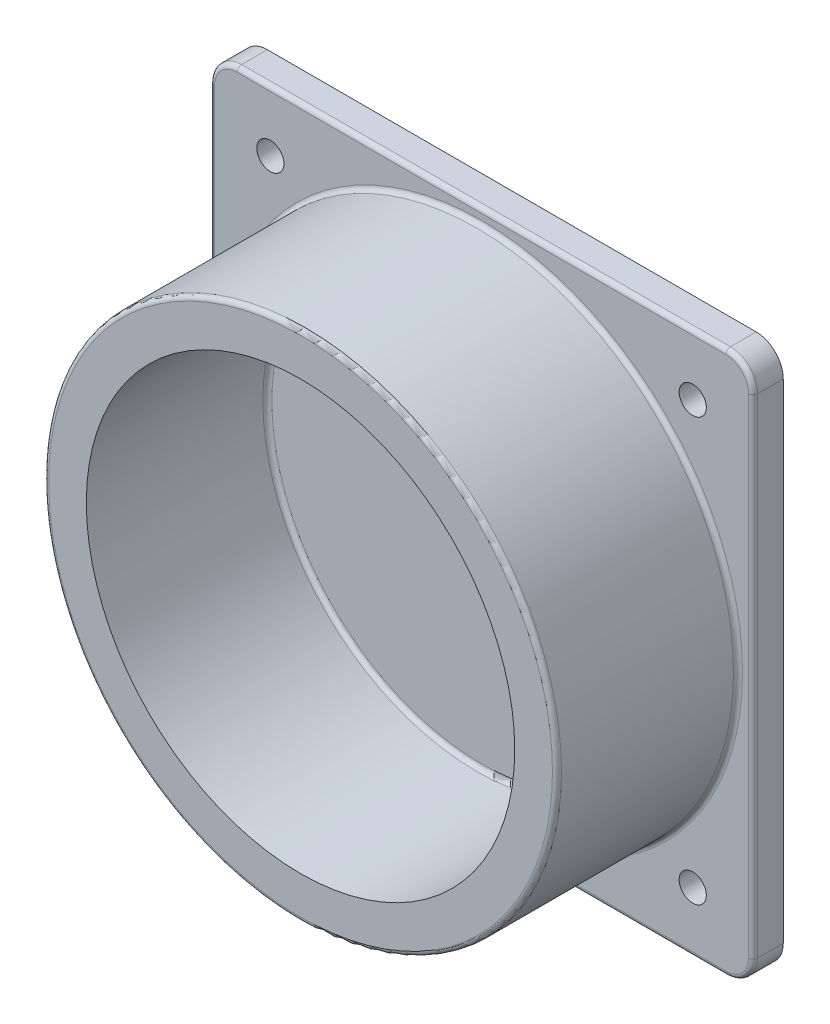
ISO-10303-21;
HEADER;
FILE_DESCRIPTION(('STEP AP214'),'2;1');
FILE_NAME('part.step','',(''),(''),'','','');
FILE_SCHEMA(('AUTOMOTIVE_DESIGN { 1 0 10303 214 1 1 1 1 }'));
ENDSEC;
DATA;
#1=APPLICATION_CONTEXT('core data for automotive mechanical design processes');
#2=APPLICATION_PROTOCOL_DEFINITION('international standard','automotive_design',2000,#1);
#3=PRODUCT_CONTEXT('',#1,'mechanical');
#4=PRODUCT('Part','Part','',(#3));
#5=PRODUCT_RELATED_PRODUCT_CATEGORY('part','',(#4));
#6=PRODUCT_DEFINITION_FORMATION('','',#4);
#7=PRODUCT_DEFINITION_CONTEXT('part definition',#1,'design');
#8=PRODUCT_DEFINITION('design','',#6,#7);
#9=PRODUCT_DEFINITION_SHAPE('','',#8);
#10=(LENGTH_UNIT() NAMED_UNIT(*) SI_UNIT(.MILLI.,.METRE.));
#11=(NAMED_UNIT(*) PLANE_ANGLE_UNIT() SI_UNIT($,.RADIAN.));
#12=(NAMED_UNIT(*) SI_UNIT($,.STERADIAN.) SOLID_ANGLE_UNIT());
#13=UNCERTAINTY_MEASURE_WITH_UNIT(LENGTH_MEASURE(1.E-05),#10,'distance_accuracy_value','');
#14=(GEOMETRIC_REPRESENTATION_CONTEXT(3) GLOBAL_UNCERTAINTY_ASSIGNED_CONTEXT((#13)) GLOBAL_UNIT_ASSIGNED_CONTEXT((#10,
#11,#12)) REPRESENTATION_CONTEXT('',''));
#15=CARTESIAN_POINT('',(0.,0.,0.));
#16=DIRECTION('',(0.,0.,1.));
#17=DIRECTION('',(1.,0.,0.));
#18=AXIS2_PLACEMENT_3D('',#15,#16,#17);
#19=CARTESIAN_POINT('',(81.,-81.,10.));
#20=DIRECTION('',(0.,0.,1.));
#21=DIRECTION('',(1.,0.,0.));
#22=AXIS2_PLACEMENT_3D('',#19,#20,#21);
#23=PLANE('',#22);
#24=DIRECTION('',(1.,0.,0.));
#25=VECTOR('',#24,1.);
#26=CARTESIAN_POINT('',(81.,-88.5,10.));
#27=LINE('',#26,#25);
#28=CARTESIAN_POINT('',(-81.,-88.5,10.));
#29=VERTEX_POINT('',#28);
#30=CARTESIAN_POINT('',(81.,-88.5,10.));
#31=VERTEX_POINT('',#30);
#32=EDGE_CURVE('E198',#29,#31,#27,.T.);
#33=ORIENTED_EDGE('',*,*,#32,.T.);
#34=CARTESIAN_POINT('',(81.,-81.,10.));
#35=DIRECTION('',(0.,0.,1.));
#36=DIRECTION('',(1.,0.,0.));
#37=AXIS2_PLACEMENT_3D('',#34,#35,#36);
#38=CIRCLE('',#37,7.49999999999999);
#39=CARTESIAN_POINT('',(88.5,-81.,10.));
#40=VERTEX_POINT('',#39);
#41=EDGE_CURVE('E200',#31,#40,#38,.T.);
#42=ORIENTED_EDGE('',*,*,#41,.T.);
#43=DIRECTION('',(0.,1.,0.));
#44=VECTOR('',#43,1.);
#45=CARTESIAN_POINT('',(88.5,81.,10.));
#46=LINE('',#45,#44);
#47=CARTESIAN_POINT('',(88.5,81.,10.));
#48=VERTEX_POINT('',#47);
#49=EDGE_CURVE('E186',#40,#48,#46,.T.);
#50=ORIENTED_EDGE('',*,*,#49,.T.);
#51=CARTESIAN_POINT('',(81.,81.,10.));
#52=DIRECTION('',(0.,0.,1.));
#53=DIRECTION('',(1.,0.,0.));
#54=AXIS2_PLACEMENT_3D('',#51,#52,#53);
#55=CIRCLE('',#54,7.49999999999999);
#56=CARTESIAN_POINT('',(81.,88.5,10.));
#57=VERTEX_POINT('',#56);
#58=EDGE_CURVE('E188',#48,#57,#55,.T.);
#59=ORIENTED_EDGE('',*,*,#58,.T.);
#60=DIRECTION('',(-1.,0.,0.));
#61=VECTOR('',#60,1.);
#62=CARTESIAN_POINT('',(-81.,88.5,10.));
#63=LINE('',#62,#61);
#64=CARTESIAN_POINT('',(-81.,88.5,10.));
#65=VERTEX_POINT('',#64);
#66=EDGE_CURVE('E190',#57,#65,#63,.T.);
#67=ORIENTED_EDGE('',*,*,#66,.T.);
#68=CARTESIAN_POINT('',(-81.,81.,10.));
#69=DIRECTION('',(0.,0.,1.));
#70=DIRECTION('',(1.,0.,0.));
#71=AXIS2_PLACEMENT_3D('',#68,#69,#70);
#72=CIRCLE('',#71,7.49999999999999);
#73=CARTESIAN_POINT('',(-88.5,81.,10.));
#74=VERTEX_POINT('',#73);
#75=EDGE_CURVE('E192',#65,#74,#72,.T.);
#76=ORIENTED_EDGE('',*,*,#75,.T.);
#77=DIRECTION('',(0.,-1.,0.));
#78=VECTOR('',#77,1.);
#79=CARTESIAN_POINT('',(-88.5,-81.,10.));
#80=LINE('',#79,#78);
#81=CARTESIAN_POINT('',(-88.5,-81.,10.));
#82=VERTEX_POINT('',#81);
#83=EDGE_CURVE('E194',#74,#82,#80,.T.);
#84=ORIENTED_EDGE('',*,*,#83,.T.);
#85=CARTESIAN_POINT('',(-81.,-81.,10.));
#86=DIRECTION('',(0.,0.,1.));
#87=DIRECTION('',(1.,0.,0.));
#88=AXIS2_PLACEMENT_3D('',#85,#86,#87);
#89=CIRCLE('',#88,7.49999999999999);
#90=EDGE_CURVE('E196',#82,#29,#89,.T.);
#91=ORIENTED_EDGE('',*,*,#90,.T.);
#92=EDGE_LOOP('',(#33,#42,#50,#59,#67,#76,#84,#91));
#93=FACE_BOUND('',#92,.T.);
#94=CARTESIAN_POINT('',(0.,0.,10.));
#95=DIRECTION('',(0.,0.,1.));
#96=DIRECTION('',(1.,0.,0.));
#97=AXIS2_PLACEMENT_3D('',#94,#95,#96);
#98=CIRCLE('',#97,86.5);
#99=CARTESIAN_POINT('',(86.5,0.,10.));
#100=VERTEX_POINT('',#99);
#101=EDGE_CURVE('E133',#100,#100,#98,.F.);
#102=ORIENTED_EDGE('',*,*,#101,.T.);
#103=EDGE_LOOP('',(#102));
#104=FACE_BOUND('',#103,.T.);
#105=CARTESIAN_POINT('',(-69.9999999999999,-70.,10.));
#106=DIRECTION('',(0.,0.,1.));
#107=DIRECTION('',(1.,0.,0.));
#108=AXIS2_PLACEMENT_3D('',#105,#106,#107);
#109=CIRCLE('',#108,4.50000000000001);
#110=CARTESIAN_POINT('',(-65.4999999999999,-70.,10.));
#111=VERTEX_POINT('',#110);
#112=EDGE_CURVE('E264',#111,#111,#109,.T.);
#113=ORIENTED_EDGE('',*,*,#112,.F.);
#114=EDGE_LOOP('',(#113));
#115=FACE_BOUND('',#114,.T.);
#116=CARTESIAN_POINT('',(-70.,70.,10.));
#117=DIRECTION('',(0.,0.,1.));
#118=DIRECTION('',(-1.,0.,0.));
#119=AXIS2_PLACEMENT_3D('',#116,#117,#118);
#120=CIRCLE('',#119,4.50000000000001);
#121=CARTESIAN_POINT('',(-74.5,70.,10.));
#122=VERTEX_POINT('',#121);
#123=EDGE_CURVE('E276',#122,#122,#120,.T.);
#124=ORIENTED_EDGE('',*,*,#123,.F.);
#125=EDGE_LOOP('',(#124));
#126=FACE_BOUND('',#125,.T.);
#127=CARTESIAN_POINT('',(70.,70.,10.));
#128=DIRECTION('',(0.,0.,1.));
#129=DIRECTION('',(1.,0.,0.));
#130=AXIS2_PLACEMENT_3D('',#127,#128,#129);
#131=CIRCLE('',#130,4.50000000000001);
#132=CARTESIAN_POINT('',(74.5,70.,10.));
#133=VERTEX_POINT('',#132);
#134=EDGE_CURVE('E153',#133,#133,#131,.T.);
#135=ORIENTED_EDGE('',*,*,#134,.F.);
#136=EDGE_LOOP('',(#135));
#137=FACE_BOUND('',#136,.T.);
#138=CARTESIAN_POINT('',(70.,-70.,10.));
#139=DIRECTION('',(0.,0.,1.));
#140=DIRECTION('',(-1.,0.,0.));
#141=AXIS2_PLACEMENT_3D('',#138,#139,#140);
#142=CIRCLE('',#141,4.50000000000001);
#143=CARTESIAN_POINT('',(65.4999999999999,-70.,10.));
#144=VERTEX_POINT('',#143);
#145=EDGE_CURVE('E270',#144,#144,#142,.T.);
#146=ORIENTED_EDGE('',*,*,#145,.F.);
#147=EDGE_LOOP('',(#146));
#148=FACE_BOUND('',#147,.T.);
#149=ADVANCED_FACE('F32',(#93,#104,#115,#126,#137,#148),#23,.T.);
#150=CARTESIAN_POINT('',(81.,-81.,0.));
#151=DIRECTION('',(0.,0.,1.));
#152=DIRECTION('',(1.,0.,0.));
#153=AXIS2_PLACEMENT_3D('',#150,#151,#152);
#154=PLANE('',#153);
#155=CARTESIAN_POINT('',(70.,-70.,0.));
#156=DIRECTION('',(0.,0.,1.));
#157=DIRECTION('',(-1.,0.,0.));
#158=AXIS2_PLACEMENT_3D('',#155,#156,#157);
#159=CIRCLE('',#158,4.50000000000001);
#160=CARTESIAN_POINT('',(65.4999999999999,-70.,0.));
#161=VERTEX_POINT('',#160);
#162=EDGE_CURVE('E267',#161,#161,#159,.T.);
#163=ORIENTED_EDGE('',*,*,#162,.T.);
#164=EDGE_LOOP('',(#163));
#165=FACE_BOUND('',#164,.T.);
#166=CARTESIAN_POINT('',(70.,70.,0.));
#167=DIRECTION('',(0.,0.,1.));
#168=DIRECTION('',(1.,0.,0.));
#169=AXIS2_PLACEMENT_3D('',#166,#167,#168);
#170=CIRCLE('',#169,4.50000000000001);
#171=CARTESIAN_POINT('',(74.5,70.,0.));
#172=VERTEX_POINT('',#171);
#173=EDGE_CURVE('E279',#172,#172,#170,.T.);
#174=ORIENTED_EDGE('',*,*,#173,.T.);
#175=EDGE_LOOP('',(#174));
#176=FACE_BOUND('',#175,.T.);
#177=CARTESIAN_POINT('',(81.,-81.,0.));
#178=DIRECTION('',(0.,0.,1.));
#179=DIRECTION('',(1.,0.,0.));
#180=AXIS2_PLACEMENT_3D('',#177,#178,#179);
#181=CIRCLE('',#180,8.99999999999999);
#182=CARTESIAN_POINT('',(81.,-90.,0.));
#183=VERTEX_POINT('',#182);
#184=CARTESIAN_POINT('',(90.,-81.,0.));
#185=VERTEX_POINT('',#184);
#186=EDGE_CURVE('E141',#183,#185,#181,.T.);
#187=ORIENTED_EDGE('',*,*,#186,.F.);
#188=DIRECTION('',(1.,0.,0.));
#189=VECTOR('',#188,1.);
#190=CARTESIAN_POINT('',(-81.,-90.,0.));
#191=LINE('',#190,#189);
#192=CARTESIAN_POINT('',(-81.,-90.,0.));
#193=VERTEX_POINT('',#192);
#194=EDGE_CURVE('E170',#193,#183,#191,.T.);
#195=ORIENTED_EDGE('',*,*,#194,.F.);
#196=CARTESIAN_POINT('',(-81.,-81.,0.));
#197=DIRECTION('',(0.,0.,1.));
#198=DIRECTION('',(-1.,0.,0.));
#199=AXIS2_PLACEMENT_3D('',#196,#197,#198);
#200=CIRCLE('',#199,8.99999999999999);
#201=CARTESIAN_POINT('',(-90.,-81.,0.));
#202=VERTEX_POINT('',#201);
#203=EDGE_CURVE('E167',#202,#193,#200,.T.);
#204=ORIENTED_EDGE('',*,*,#203,.F.);
#205=DIRECTION('',(0.,-1.,0.));
#206=VECTOR('',#205,1.);
#207=CARTESIAN_POINT('',(-90.,-81.,0.));
#208=LINE('',#207,#206);
#209=CARTESIAN_POINT('',(-90.,81.,0.));
#210=VERTEX_POINT('',#209);
#211=EDGE_CURVE('E164',#210,#202,#208,.T.);
#212=ORIENTED_EDGE('',*,*,#211,.F.);
#213=CARTESIAN_POINT('',(-81.,81.,0.));
#214=DIRECTION('',(0.,0.,1.));
#215=DIRECTION('',(-1.,0.,0.));
#216=AXIS2_PLACEMENT_3D('',#213,#214,#215);
#217=CIRCLE('',#216,8.99999999999999);
#218=CARTESIAN_POINT('',(-81.,90.,0.));
#219=VERTEX_POINT('',#218);
#220=EDGE_CURVE('E161',#219,#210,#217,.T.);
#221=ORIENTED_EDGE('',*,*,#220,.F.);
#222=DIRECTION('',(-1.,0.,0.));
#223=VECTOR('',#222,1.);
#224=CARTESIAN_POINT('',(-81.,90.,0.));
#225=LINE('',#224,#223);
#226=CARTESIAN_POINT('',(81.,90.,0.));
#227=VERTEX_POINT('',#226);
#228=EDGE_CURVE('E158',#227,#219,#225,.T.);
#229=ORIENTED_EDGE('',*,*,#228,.F.);
#230=CARTESIAN_POINT('',(81.,81.,0.));
#231=DIRECTION('',(0.,0.,1.));
#232=DIRECTION('',(-1.,0.,0.));
#233=AXIS2_PLACEMENT_3D('',#230,#231,#232);
#234=CIRCLE('',#233,8.99999999999999);
#235=CARTESIAN_POINT('',(90.,81.,0.));
#236=VERTEX_POINT('',#235);
#237=EDGE_CURVE('E144',#236,#227,#234,.T.);
#238=ORIENTED_EDGE('',*,*,#237,.F.);
#239=DIRECTION('',(0.,1.,0.));
#240=VECTOR('',#239,1.);
#241=CARTESIAN_POINT('',(90.,-81.,0.));
#242=LINE('',#241,#240);
#243=EDGE_CURVE('E126',#185,#236,#242,.T.);
#244=ORIENTED_EDGE('',*,*,#243,.F.);
#245=EDGE_LOOP('',(#187,#195,#204,#212,#221,#229,#238,#244));
#246=FACE_BOUND('',#245,.T.);
#247=CARTESIAN_POINT('',(0.,0.,0.));
#248=DIRECTION('',(0.,0.,1.));
#249=DIRECTION('',(1.,0.,0.));
#250=AXIS2_PLACEMENT_3D('',#247,#248,#249);
#251=CIRCLE('',#250,9.);
#252=CARTESIAN_POINT('',(9.00000000000001,0.,0.));
#253=VERTEX_POINT('',#252);
#254=EDGE_CURVE('E150',#253,#253,#251,.T.);
#255=ORIENTED_EDGE('',*,*,#254,.T.);
#256=EDGE_LOOP('',(#255));
#257=FACE_BOUND('',#256,.T.);
#258=CARTESIAN_POINT('',(-70.,70.,0.));
#259=DIRECTION('',(0.,0.,1.));
#260=DIRECTION('',(-1.,0.,0.));
#261=AXIS2_PLACEMENT_3D('',#258,#259,#260);
#262=CIRCLE('',#261,4.50000000000001);
#263=CARTESIAN_POINT('',(-74.5,70.,0.));
#264=VERTEX_POINT('',#263);
#265=EDGE_CURVE('E273',#264,#264,#262,.T.);
#266=ORIENTED_EDGE('',*,*,#265,.T.);
#267=EDGE_LOOP('',(#266));
#268=FACE_BOUND('',#267,.T.);
#269=CARTESIAN_POINT('',(-69.9999999999999,-70.,0.));
#270=DIRECTION('',(0.,0.,1.));
#271=DIRECTION('',(1.,0.,0.));
#272=AXIS2_PLACEMENT_3D('',#269,#270,#271);
#273=CIRCLE('',#272,4.50000000000001);
#274=CARTESIAN_POINT('',(-65.4999999999999,-70.,0.));
#275=VERTEX_POINT('',#274);
#276=EDGE_CURVE('E261',#275,#275,#273,.T.);
#277=ORIENTED_EDGE('',*,*,#276,.T.);
#278=EDGE_LOOP('',(#277));
#279=FACE_BOUND('',#278,.T.);
#280=ADVANCED_FACE('F138',(#165,#176,#246,#257,#268,#279),#154,.F.);
#281=CARTESIAN_POINT('',(81.,-81.,10.));
#282=DIRECTION('',(0.,0.,-1.));
#283=DIRECTION('',(-1.,0.,0.));
#284=AXIS2_PLACEMENT_3D('',#281,#282,#283);
#285=CYLINDRICAL_SURFACE('',#284,8.99999999999999);
#286=DIRECTION('',(0.,0.,-1.));
#287=VECTOR('',#286,1.);
#288=CARTESIAN_POINT('',(90.,-81.,10.));
#289=LINE('',#288,#287);
#290=CARTESIAN_POINT('',(90.,-81.,8.5));
#291=VERTEX_POINT('',#290);
#292=EDGE_CURVE('E123',#291,#185,#289,.T.);
#293=ORIENTED_EDGE('',*,*,#292,.F.);
#294=CARTESIAN_POINT('',(81.,-81.,8.5));
#295=DIRECTION('',(0.,0.,1.));
#296=DIRECTION('',(1.,0.,0.));
#297=AXIS2_PLACEMENT_3D('',#294,#295,#296);
#298=CIRCLE('',#297,8.99999999999999);
#299=CARTESIAN_POINT('',(81.,-90.,8.5));
#300=VERTEX_POINT('',#299);
#301=EDGE_CURVE('E203',#291,#300,#298,.F.);
#302=ORIENTED_EDGE('',*,*,#301,.T.);
#303=DIRECTION('',(0.,0.,-1.));
#304=VECTOR('',#303,1.);
#305=CARTESIAN_POINT('',(81.,-90.,10.));
#306=LINE('',#305,#304);
#307=EDGE_CURVE('E148',#300,#183,#306,.T.);
#308=ORIENTED_EDGE('',*,*,#307,.T.);
#309=ORIENTED_EDGE('',*,*,#186,.T.);
#310=EDGE_LOOP('',(#293,#302,#308,#309));
#311=FACE_BOUND('',#310,.T.);
#312=ADVANCED_FACE('F146',(#311),#285,.T.);
#313=CARTESIAN_POINT('',(90.,-81.,10.));
#314=DIRECTION('',(-1.,0.,0.));
#315=DIRECTION('',(0.,0.,1.));
#316=AXIS2_PLACEMENT_3D('',#313,#314,#315);
#317=PLANE('',#316);
#318=DIRECTION('',(0.,0.,-1.));
#319=VECTOR('',#318,1.);
#320=CARTESIAN_POINT('',(90.,81.,10.));
#321=LINE('',#320,#319);
#322=CARTESIAN_POINT('',(90.,81.,8.5));
#323=VERTEX_POINT('',#322);
#324=EDGE_CURVE('E134',#323,#236,#321,.T.);
#325=ORIENTED_EDGE('',*,*,#324,.F.);
#326=DIRECTION('',(0.,1.,0.));
#327=VECTOR('',#326,1.);
#328=CARTESIAN_POINT('',(90.,-81.,8.5));
#329=LINE('',#328,#327);
#330=EDGE_CURVE('E11',#323,#291,#329,.F.);
#331=ORIENTED_EDGE('',*,*,#330,.T.);
#332=ORIENTED_EDGE('',*,*,#292,.T.);
#333=ORIENTED_EDGE('',*,*,#243,.T.);
#334=EDGE_LOOP('',(#325,#331,#332,#333));
#335=FACE_BOUND('',#334,.T.);
#336=ADVANCED_FACE('F125',(#335),#317,.F.);
#337=CARTESIAN_POINT('',(81.,81.,10.));
#338=DIRECTION('',(0.,0.,-1.));
#339=DIRECTION('',(-1.,0.,0.));
#340=AXIS2_PLACEMENT_3D('',#337,#338,#339);
#341=CYLINDRICAL_SURFACE('',#340,8.99999999999999);
#342=DIRECTION('',(0.,0.,-1.));
#343=VECTOR('',#342,1.);
#344=CARTESIAN_POINT('',(81.,90.,10.));
#345=LINE('',#344,#343);
#346=CARTESIAN_POINT('',(81.,90.,8.5));
#347=VERTEX_POINT('',#346);
#348=EDGE_CURVE('E181',#347,#227,#345,.T.);
#349=ORIENTED_EDGE('',*,*,#348,.F.);
#350=CARTESIAN_POINT('',(81.,81.,8.5));
#351=DIRECTION('',(0.,0.,1.));
#352=DIRECTION('',(1.,0.,0.));
#353=AXIS2_PLACEMENT_3D('',#350,#351,#352);
#354=CIRCLE('',#353,8.99999999999999);
#355=EDGE_CURVE('E49',#347,#323,#354,.F.);
#356=ORIENTED_EDGE('',*,*,#355,.T.);
#357=ORIENTED_EDGE('',*,*,#324,.T.);
#358=ORIENTED_EDGE('',*,*,#237,.T.);
#359=EDGE_LOOP('',(#349,#356,#357,#358));
#360=FACE_BOUND('',#359,.T.);
#361=ADVANCED_FACE('F331',(#360),#341,.T.);
#362=CARTESIAN_POINT('',(-81.,90.,10.));
#363=DIRECTION('',(0.,-1.,0.));
#364=DIRECTION('',(0.,0.,-1.));
#365=AXIS2_PLACEMENT_3D('',#362,#363,#364);
#366=PLANE('',#365);
#367=DIRECTION('',(0.,0.,-1.));
#368=VECTOR('',#367,1.);
#369=CARTESIAN_POINT('',(-81.,90.,10.));
#370=LINE('',#369,#368);
#371=CARTESIAN_POINT('',(-81.,90.,8.5));
#372=VERTEX_POINT('',#371);
#373=EDGE_CURVE('E179',#372,#219,#370,.T.);
#374=ORIENTED_EDGE('',*,*,#373,.F.);
#375=DIRECTION('',(-1.,0.,0.));
#376=VECTOR('',#375,1.);
#377=CARTESIAN_POINT('',(81.,90.,8.5));
#378=LINE('',#377,#376);
#379=EDGE_CURVE('E57',#372,#347,#378,.F.);
#380=ORIENTED_EDGE('',*,*,#379,.T.);
#381=ORIENTED_EDGE('',*,*,#348,.T.);
#382=ORIENTED_EDGE('',*,*,#228,.T.);
#383=EDGE_LOOP('',(#374,#380,#381,#382));
#384=FACE_BOUND('',#383,.T.);
#385=ADVANCED_FACE('F327',(#384),#366,.F.);
#386=CARTESIAN_POINT('',(-81.,81.,10.));
#387=DIRECTION('',(0.,0.,-1.));
#388=DIRECTION('',(-1.,0.,0.));
#389=AXIS2_PLACEMENT_3D('',#386,#387,#388);
#390=CYLINDRICAL_SURFACE('',#389,8.99999999999999);
#391=DIRECTION('',(0.,0.,-1.));
#392=VECTOR('',#391,1.);
#393=CARTESIAN_POINT('',(-90.,81.,10.));
#394=LINE('',#393,#392);
#395=CARTESIAN_POINT('',(-90.,81.,8.5));
#396=VERTEX_POINT('',#395);
#397=EDGE_CURVE('E177',#396,#210,#394,.T.);
#398=ORIENTED_EDGE('',*,*,#397,.F.);
#399=CARTESIAN_POINT('',(-81.,81.,8.5));
#400=DIRECTION('',(0.,0.,1.));
#401=DIRECTION('',(1.,0.,0.));
#402=AXIS2_PLACEMENT_3D('',#399,#400,#401);
#403=CIRCLE('',#402,8.99999999999999);
#404=EDGE_CURVE('E211',#396,#372,#403,.F.);
#405=ORIENTED_EDGE('',*,*,#404,.T.);
#406=ORIENTED_EDGE('',*,*,#373,.T.);
#407=ORIENTED_EDGE('',*,*,#220,.T.);
#408=EDGE_LOOP('',(#398,#405,#406,#407));
#409=FACE_BOUND('',#408,.T.);
#410=ADVANCED_FACE('F323',(#409),#390,.T.);
#411=CARTESIAN_POINT('',(-90.,-81.,10.));
#412=DIRECTION('',(1.,0.,0.));
#413=DIRECTION('',(0.,0.,-1.));
#414=AXIS2_PLACEMENT_3D('',#411,#412,#413);
#415=PLANE('',#414);
#416=DIRECTION('',(0.,0.,-1.));
#417=VECTOR('',#416,1.);
#418=CARTESIAN_POINT('',(-90.,-81.,10.));
#419=LINE('',#418,#417);
#420=CARTESIAN_POINT('',(-90.,-81.,8.5));
#421=VERTEX_POINT('',#420);
#422=EDGE_CURVE('E175',#421,#202,#419,.T.);
#423=ORIENTED_EDGE('',*,*,#422,.F.);
#424=DIRECTION('',(0.,-1.,0.));
#425=VECTOR('',#424,1.);
#426=CARTESIAN_POINT('',(-90.,81.,8.5));
#427=LINE('',#426,#425);
#428=EDGE_CURVE('E209',#421,#396,#427,.F.);
#429=ORIENTED_EDGE('',*,*,#428,.T.);
#430=ORIENTED_EDGE('',*,*,#397,.T.);
#431=ORIENTED_EDGE('',*,*,#211,.T.);
#432=EDGE_LOOP('',(#423,#429,#430,#431));
#433=FACE_BOUND('',#432,.T.);
#434=ADVANCED_FACE('F319',(#433),#415,.F.);
#435=CARTESIAN_POINT('',(-81.,-81.,10.));
#436=DIRECTION('',(0.,0.,-1.));
#437=DIRECTION('',(-1.,0.,0.));
#438=AXIS2_PLACEMENT_3D('',#435,#436,#437);
#439=CYLINDRICAL_SURFACE('',#438,8.99999999999999);
#440=DIRECTION('',(0.,0.,-1.));
#441=VECTOR('',#440,1.);
#442=CARTESIAN_POINT('',(-81.,-90.,10.));
#443=LINE('',#442,#441);
#444=CARTESIAN_POINT('',(-81.,-90.,8.5));
#445=VERTEX_POINT('',#444);
#446=EDGE_CURVE('E173',#445,#193,#443,.T.);
#447=ORIENTED_EDGE('',*,*,#446,.F.);
#448=CARTESIAN_POINT('',(-81.,-81.,8.5));
#449=DIRECTION('',(0.,0.,1.));
#450=DIRECTION('',(1.,0.,0.));
#451=AXIS2_PLACEMENT_3D('',#448,#449,#450);
#452=CIRCLE('',#451,8.99999999999999);
#453=EDGE_CURVE('E207',#445,#421,#452,.F.);
#454=ORIENTED_EDGE('',*,*,#453,.T.);
#455=ORIENTED_EDGE('',*,*,#422,.T.);
#456=ORIENTED_EDGE('',*,*,#203,.T.);
#457=EDGE_LOOP('',(#447,#454,#455,#456));
#458=FACE_BOUND('',#457,.T.);
#459=ADVANCED_FACE('F315',(#458),#439,.T.);
#460=CARTESIAN_POINT('',(-81.,-90.,10.));
#461=DIRECTION('',(0.,1.,0.));
#462=DIRECTION('',(0.,0.,1.));
#463=AXIS2_PLACEMENT_3D('',#460,#461,#462);
#464=PLANE('',#463);
#465=ORIENTED_EDGE('',*,*,#307,.F.);
#466=DIRECTION('',(1.,0.,0.));
#467=VECTOR('',#466,1.);
#468=CARTESIAN_POINT('',(-81.,-90.,8.5));
#469=LINE('',#468,#467);
#470=EDGE_CURVE('E205',#300,#445,#469,.F.);
#471=ORIENTED_EDGE('',*,*,#470,.T.);
#472=ORIENTED_EDGE('',*,*,#446,.T.);
#473=ORIENTED_EDGE('',*,*,#194,.T.);
#474=EDGE_LOOP('',(#465,#471,#472,#473));
#475=FACE_BOUND('',#474,.T.);
#476=ADVANCED_FACE('F300',(#475),#464,.F.);
#477=CARTESIAN_POINT('',(0.,0.,10.));
#478=DIRECTION('',(0.,0.,-1.));
#479=DIRECTION('',(-1.,0.,0.));
#480=AXIS2_PLACEMENT_3D('',#477,#478,#479);
#481=CYLINDRICAL_SURFACE('',#480,9.);
#482=CARTESIAN_POINT('',(0.,0.,10.));
#483=DIRECTION('',(0.,0.,1.));
#484=DIRECTION('',(1.,0.,0.));
#485=AXIS2_PLACEMENT_3D('',#482,#483,#484);
#486=CIRCLE('',#485,9.);
#487=CARTESIAN_POINT('',(9.00000000000001,0.,10.));
#488=VERTEX_POINT('',#487);
#489=EDGE_CURVE('E256',#488,#488,#486,.T.);
#490=ORIENTED_EDGE('',*,*,#489,.T.);
#491=EDGE_LOOP('',(#490));
#492=FACE_BOUND('',#491,.T.);
#493=ORIENTED_EDGE('',*,*,#254,.F.);
#494=EDGE_LOOP('',(#493));
#495=FACE_BOUND('',#494,.T.);
#496=ADVANCED_FACE('F290',(#492,#495),#481,.F.);
#497=CARTESIAN_POINT('',(70.,70.,10.));
#498=DIRECTION('',(0.,0.,-1.));
#499=DIRECTION('',(-1.,0.,0.));
#500=AXIS2_PLACEMENT_3D('',#497,#498,#499);
#501=CYLINDRICAL_SURFACE('',#500,4.50000000000001);
#502=ORIENTED_EDGE('',*,*,#134,.T.);
#503=EDGE_LOOP('',(#502));
#504=FACE_BOUND('',#503,.T.);
#505=ORIENTED_EDGE('',*,*,#173,.F.);
#506=EDGE_LOOP('',(#505));
#507=FACE_BOUND('',#506,.T.);
#508=ADVANCED_FACE('F287',(#504,#507),#501,.F.);
#509=CARTESIAN_POINT('',(-70.,70.,10.));
#510=DIRECTION('',(0.,0.,-1.));
#511=DIRECTION('',(-1.,0.,0.));
#512=AXIS2_PLACEMENT_3D('',#509,#510,#511);
#513=CYLINDRICAL_SURFACE('',#512,4.50000000000001);
#514=ORIENTED_EDGE('',*,*,#123,.T.);
#515=EDGE_LOOP('',(#514));
#516=FACE_BOUND('',#515,.T.);
#517=ORIENTED_EDGE('',*,*,#265,.F.);
#518=EDGE_LOOP('',(#517));
#519=FACE_BOUND('',#518,.T.);
#520=ADVANCED_FACE('F289',(#516,#519),#513,.F.);
#521=CARTESIAN_POINT('',(70.,-70.,10.));
#522=DIRECTION('',(0.,0.,-1.));
#523=DIRECTION('',(-1.,0.,0.));
#524=AXIS2_PLACEMENT_3D('',#521,#522,#523);
#525=CYLINDRICAL_SURFACE('',#524,4.50000000000001);
#526=ORIENTED_EDGE('',*,*,#145,.T.);
#527=EDGE_LOOP('',(#526));
#528=FACE_BOUND('',#527,.T.);
#529=ORIENTED_EDGE('',*,*,#162,.F.);
#530=EDGE_LOOP('',(#529));
#531=FACE_BOUND('',#530,.T.);
#532=ADVANCED_FACE('F297',(#528,#531),#525,.F.);
#533=CARTESIAN_POINT('',(-69.9999999999999,-70.,10.));
#534=DIRECTION('',(0.,0.,-1.));
#535=DIRECTION('',(-1.,0.,0.));
#536=AXIS2_PLACEMENT_3D('',#533,#534,#535);
#537=CYLINDRICAL_SURFACE('',#536,4.50000000000001);
#538=ORIENTED_EDGE('',*,*,#112,.T.);
#539=EDGE_LOOP('',(#538));
#540=FACE_BOUND('',#539,.T.);
#541=ORIENTED_EDGE('',*,*,#276,.F.);
#542=EDGE_LOOP('',(#541));
#543=FACE_BOUND('',#542,.T.);
#544=ADVANCED_FACE('F395',(#540,#543),#537,.F.);
#545=CARTESIAN_POINT('',(0.,0.,70.));
#546=DIRECTION('',(0.,0.,-1.));
#547=DIRECTION('',(-1.,0.,0.));
#548=AXIS2_PLACEMENT_3D('',#545,#546,#547);
#549=CYLINDRICAL_SURFACE('',#548,85.);
#550=CARTESIAN_POINT('',(0.,0.,68.5));
#551=DIRECTION('',(0.,0.,1.));
#552=DIRECTION('',(1.,0.,0.));
#553=AXIS2_PLACEMENT_3D('',#550,#551,#552);
#554=CIRCLE('',#553,85.);
#555=CARTESIAN_POINT('',(-85.,0.,68.5));
#556=VERTEX_POINT('',#555);
#557=EDGE_CURVE('E221',#556,#556,#554,.F.);
#558=CARTESIAN_POINT('',(0.,0.,11.5));
#559=DIRECTION('',(0.,0.,1.));
#560=DIRECTION('',(1.,0.,0.));
#561=AXIS2_PLACEMENT_3D('',#558,#559,#560);
#562=CIRCLE('',#561,85.);
#563=CARTESIAN_POINT('',(-85.,0.,11.5));
#564=VERTEX_POINT('',#563);
#565=EDGE_CURVE('E218',#564,#564,#562,.T.);
#566=CARTESIAN_POINT('',(-85.,0.,68.5));
#567=CARTESIAN_POINT('',(-85.,0.,67.90625));
#568=CARTESIAN_POINT('',(-85.,0.,67.3125));
#569=CARTESIAN_POINT('',(-85.,0.,66.125));
#570=CARTESIAN_POINT('',(-85.,0.,65.53125));
#571=CARTESIAN_POINT('',(-85.,0.,64.34375));
#572=CARTESIAN_POINT('',(-85.,0.,63.75));
#573=CARTESIAN_POINT('',(-85.,0.,62.5625));
#574=CARTESIAN_POINT('',(-85.,0.,61.96875));
#575=CARTESIAN_POINT('',(-85.,0.,60.78125));
#576=CARTESIAN_POINT('',(-85.,0.,60.1875));
#577=CARTESIAN_POINT('',(-85.,0.,59.));
#578=CARTESIAN_POINT('',(-85.,0.,58.40625));
#579=CARTESIAN_POINT('',(-85.,0.,57.21875));
#580=CARTESIAN_POINT('',(-85.,0.,56.625));
#581=CARTESIAN_POINT('',(-85.,0.,55.4375));
#582=CARTESIAN_POINT('',(-85.,0.,54.84375));
#583=CARTESIAN_POINT('',(-85.,0.,53.65625));
#584=CARTESIAN_POINT('',(-85.,0.,53.0625));
#585=CARTESIAN_POINT('',(-85.,0.,51.875));
#586=CARTESIAN_POINT('',(-85.,0.,51.28125));
#587=CARTESIAN_POINT('',(-85.,0.,50.09375));
#588=CARTESIAN_POINT('',(-85.,0.,49.5));
#589=CARTESIAN_POINT('',(-85.,0.,48.3125));
#590=CARTESIAN_POINT('',(-85.,0.,47.71875));
#591=CARTESIAN_POINT('',(-85.,0.,46.53125));
#592=CARTESIAN_POINT('',(-85.,0.,45.9375));
#593=CARTESIAN_POINT('',(-85.,0.,44.75));
#594=CARTESIAN_POINT('',(-85.,0.,44.15625));
#595=CARTESIAN_POINT('',(-85.,0.,42.96875));
#596=CARTESIAN_POINT('',(-85.,0.,42.375));
#597=CARTESIAN_POINT('',(-85.,0.,41.1875));
#598=CARTESIAN_POINT('',(-85.,0.,40.59375));
#599=CARTESIAN_POINT('',(-85.,0.,39.40625));
#600=CARTESIAN_POINT('',(-85.,0.,38.8125));
#601=CARTESIAN_POINT('',(-85.,0.,37.625));
#602=CARTESIAN_POINT('',(-85.,0.,37.03125));
#603=CARTESIAN_POINT('',(-85.,0.,35.84375));
#604=CARTESIAN_POINT('',(-85.,0.,35.25));
#605=CARTESIAN_POINT('',(-85.,0.,34.0625));
#606=CARTESIAN_POINT('',(-85.,0.,33.46875));
#607=CARTESIAN_POINT('',(-85.,0.,32.28125));
#608=CARTESIAN_POINT('',(-85.,0.,31.6875));
#609=CARTESIAN_POINT('',(-85.,0.,30.5));
#610=CARTESIAN_POINT('',(-85.,0.,29.90625));
#611=CARTESIAN_POINT('',(-85.,0.,28.71875));
#612=CARTESIAN_POINT('',(-85.,0.,28.125));
#613=CARTESIAN_POINT('',(-85.,0.,26.9375));
#614=CARTESIAN_POINT('',(-85.,0.,26.34375));
#615=CARTESIAN_POINT('',(-85.,0.,25.15625));
#616=CARTESIAN_POINT('',(-85.,0.,24.5625));
#617=CARTESIAN_POINT('',(-85.,0.,23.375));
#618=CARTESIAN_POINT('',(-85.,0.,22.78125));
#619=CARTESIAN_POINT('',(-85.,0.,21.59375));
#620=CARTESIAN_POINT('',(-85.,0.,21.));
#621=CARTESIAN_POINT('',(-85.,0.,19.8125));
#622=CARTESIAN_POINT('',(-85.,0.,19.21875));
#623=CARTESIAN_POINT('',(-85.,0.,18.03125));
#624=CARTESIAN_POINT('',(-85.,0.,17.4375));
#625=CARTESIAN_POINT('',(-85.,0.,16.25));
#626=CARTESIAN_POINT('',(-85.,0.,15.65625));
#627=CARTESIAN_POINT('',(-85.,0.,14.46875));
#628=CARTESIAN_POINT('',(-85.,0.,13.875));
#629=CARTESIAN_POINT('',(-85.,0.,12.6875));
#630=CARTESIAN_POINT('',(-85.,0.,12.09375));
#631=CARTESIAN_POINT('',(-85.,0.,11.5));
#632=B_SPLINE_CURVE_WITH_KNOTS('',3,(#566,#567,#568,#569,#570,#571,#572,#573,#574,#575,#576,
#577,#578,#579,#580,#581,#582,#583,#584,#585,#586,#587,#588,#589,#590,#591,#592,#593,#594,#595,
#596,#597,#598,#599,#600,#601,#602,#603,#604,#605,#606,#607,#608,#609,#610,#611,#612,#613,#614,
#615,#616,#617,#618,#619,#620,#621,#622,#623,#624,#625,#626,#627,#628,#629,#630,#631),
.UNSPECIFIED.,.F.,.F.,(4,2,2,2,2,2,2,2,2,2,2,2,2,2,2,2,2,2,2,2,2,2,2,2,2,2,2,2,2,2,2,2,4),(0.,
1.78125,3.5625,5.34374999999999,7.12499999999999,8.90624999999999,10.6875,12.46875,14.25,
16.03125,17.8125,19.59375,21.375,23.15625,24.9375,26.71875,28.5,30.28125,32.0625,33.84375,
35.625,37.40625,39.1875,40.96875,42.75,44.53125,46.3125,48.09375,49.875,51.65625,53.4375,
55.21875,57.),.UNSPECIFIED.);
#633=EDGE_CURVE('BSEAM397',#556,#564,#632,.T.);
#634=ORIENTED_EDGE('',*,*,#557,.T.);
#635=ORIENTED_EDGE('',*,*,#565,.T.);
#636=ORIENTED_EDGE('',*,*,#633,.T.);
#637=ORIENTED_EDGE('',*,*,#633,.F.);
#638=EDGE_LOOP('',(#634,#636,#635,#637));
#639=FACE_BOUND('',#638,.T.);
#640=ADVANCED_FACE('F397',(#639),#549,.T.);
#641=CARTESIAN_POINT('',(0.,0.,70.));
#642=DIRECTION('',(0.,0.,1.));
#643=DIRECTION('',(1.,0.,0.));
#644=AXIS2_PLACEMENT_3D('',#641,#642,#643);
#645=PLANE('',#644);
#646=CARTESIAN_POINT('',(0.,0.,70.));
#647=DIRECTION('',(0.,0.,1.));
#648=DIRECTION('',(1.,0.,0.));
#649=AXIS2_PLACEMENT_3D('',#646,#647,#648);
#650=CIRCLE('',#649,83.5);
#651=CARTESIAN_POINT('',(83.5,0.,70.));
#652=VERTEX_POINT('',#651);
#653=EDGE_CURVE('E215',#652,#652,#650,.T.);
#654=ORIENTED_EDGE('',*,*,#653,.T.);
#655=EDGE_LOOP('',(#654));
#656=FACE_BOUND('',#655,.T.);
#657=CARTESIAN_POINT('',(0.,0.,70.));
#658=DIRECTION('',(0.,0.,1.));
#659=DIRECTION('',(1.,0.,0.));
#660=AXIS2_PLACEMENT_3D('',#657,#658,#659);
#661=CIRCLE('',#660,71.);
#662=CARTESIAN_POINT('',(71.,0.,70.));
#663=VERTEX_POINT('',#662);
#664=EDGE_CURVE('E250',#663,#663,#661,.T.);
#665=ORIENTED_EDGE('',*,*,#664,.F.);
#666=EDGE_LOOP('',(#665));
#667=FACE_BOUND('',#666,.T.);
#668=ADVANCED_FACE('F404',(#656,#667),#645,.T.);
#669=CARTESIAN_POINT('',(0.,0.,10.));
#670=DIRECTION('',(0.,0.,1.));
#671=DIRECTION('',(1.,0.,0.));
#672=AXIS2_PLACEMENT_3D('',#669,#670,#671);
#673=CYLINDRICAL_SURFACE('',#672,71.);
#674=CARTESIAN_POINT('',(0.,0.,11.5));
#675=DIRECTION('',(0.,0.,1.));
#676=DIRECTION('',(1.,0.,0.));
#677=AXIS2_PLACEMENT_3D('',#674,#675,#676);
#678=CIRCLE('',#677,71.);
#679=CARTESIAN_POINT('',(71.,0.,11.5));
#680=VERTEX_POINT('',#679);
#681=EDGE_CURVE('E41',#680,#680,#678,.F.);
#682=CARTESIAN_POINT('',(71.,0.,11.5));
#683=CARTESIAN_POINT('',(71.,0.,12.109375));
#684=CARTESIAN_POINT('',(71.,0.,12.71875));
#685=CARTESIAN_POINT('',(71.,0.,13.9375));
#686=CARTESIAN_POINT('',(71.,0.,14.546875));
#687=CARTESIAN_POINT('',(71.,0.,15.765625));
#688=CARTESIAN_POINT('',(71.,0.,16.375));
#689=CARTESIAN_POINT('',(71.,0.,17.59375));
#690=CARTESIAN_POINT('',(71.,0.,18.203125));
#691=CARTESIAN_POINT('',(71.,0.,19.421875));
#692=CARTESIAN_POINT('',(71.,0.,20.03125));
#693=CARTESIAN_POINT('',(71.,0.,21.25));
#694=CARTESIAN_POINT('',(71.,0.,21.859375));
#695=CARTESIAN_POINT('',(71.,0.,23.078125));
#696=CARTESIAN_POINT('',(71.,0.,23.6875));
#697=CARTESIAN_POINT('',(71.,0.,24.90625));
#698=CARTESIAN_POINT('',(71.,0.,25.515625));
#699=CARTESIAN_POINT('',(71.,0.,26.734375));
#700=CARTESIAN_POINT('',(71.,0.,27.34375));
#701=CARTESIAN_POINT('',(71.,0.,28.5625));
#702=CARTESIAN_POINT('',(71.,0.,29.171875));
#703=CARTESIAN_POINT('',(71.,0.,30.390625));
#704=CARTESIAN_POINT('',(71.,0.,31.));
#705=CARTESIAN_POINT('',(71.,0.,32.21875));
#706=CARTESIAN_POINT('',(71.,0.,32.828125));
#707=CARTESIAN_POINT('',(71.,0.,34.046875));
#708=CARTESIAN_POINT('',(71.,0.,34.65625));
#709=CARTESIAN_POINT('',(71.,0.,35.875));
#710=CARTESIAN_POINT('',(71.,0.,36.484375));
#711=CARTESIAN_POINT('',(71.,0.,37.703125));
#712=CARTESIAN_POINT('',(71.,0.,38.3125));
#713=CARTESIAN_POINT('',(71.,0.,39.53125));
#714=CARTESIAN_POINT('',(71.,0.,40.140625));
#715=CARTESIAN_POINT('',(71.,0.,41.359375));
#716=CARTESIAN_POINT('',(71.,0.,41.96875));
#717=CARTESIAN_POINT('',(71.,0.,43.1875));
#718=CARTESIAN_POINT('',(71.,0.,43.796875));
#719=CARTESIAN_POINT('',(71.,0.,45.015625));
#720=CARTESIAN_POINT('',(71.,0.,45.625));
#721=CARTESIAN_POINT('',(71.,0.,46.84375));
#722=CARTESIAN_POINT('',(71.,0.,47.453125));
#723=CARTESIAN_POINT('',(71.,0.,48.671875));
#724=CARTESIAN_POINT('',(71.,0.,49.28125));
#725=CARTESIAN_POINT('',(71.,0.,50.5));
#726=CARTESIAN_POINT('',(71.,0.,51.109375));
#727=CARTESIAN_POINT('',(71.,0.,52.328125));
#728=CARTESIAN_POINT('',(71.,0.,52.9375));
#729=CARTESIAN_POINT('',(71.,0.,54.15625));
#730=CARTESIAN_POINT('',(71.,0.,54.765625));
#731=CARTESIAN_POINT('',(71.,0.,55.984375));
#732=CARTESIAN_POINT('',(71.,0.,56.59375));
#733=CARTESIAN_POINT('',(71.,0.,57.8125));
#734=CARTESIAN_POINT('',(71.,0.,58.421875));
#735=CARTESIAN_POINT('',(71.,0.,59.640625));
#736=CARTESIAN_POINT('',(71.,0.,60.25));
#737=CARTESIAN_POINT('',(71.,0.,61.46875));
#738=CARTESIAN_POINT('',(71.,0.,62.078125));
#739=CARTESIAN_POINT('',(71.,0.,63.296875));
#740=CARTESIAN_POINT('',(71.,0.,63.90625));
#741=CARTESIAN_POINT('',(71.,0.,65.125));
#742=CARTESIAN_POINT('',(71.,0.,65.734375));
#743=CARTESIAN_POINT('',(71.,0.,66.953125));
#744=CARTESIAN_POINT('',(71.,0.,67.5625));
#745=CARTESIAN_POINT('',(71.,0.,68.78125));
#746=CARTESIAN_POINT('',(71.,0.,69.390625));
#747=CARTESIAN_POINT('',(71.,0.,70.));
#748=B_SPLINE_CURVE_WITH_KNOTS('',3,(#682,#683,#684,#685,#686,#687,#688,#689,#690,#691,#692,
#693,#694,#695,#696,#697,#698,#699,#700,#701,#702,#703,#704,#705,#706,#707,#708,#709,#710,#711,
#712,#713,#714,#715,#716,#717,#718,#719,#720,#721,#722,#723,#724,#725,#726,#727,#728,#729,#730,
#731,#732,#733,#734,#735,#736,#737,#738,#739,#740,#741,#742,#743,#744,#745,#746,#747),
.UNSPECIFIED.,.F.,.F.,(4,2,2,2,2,2,2,2,2,2,2,2,2,2,2,2,2,2,2,2,2,2,2,2,2,2,2,2,2,2,2,2,4),(0.,
1.828125,3.65625,5.484375,7.3125,9.140625,10.96875,12.796875,14.625,16.453125,18.28125,
20.109375,21.9375,23.765625,25.59375,27.421875,29.25,31.078125,32.90625,34.734375,36.5625,
38.390625,40.21875,42.046875,43.875,45.703125,47.53125,49.359375,51.1875,53.015625,54.84375,
56.671875,58.5),.UNSPECIFIED.);
#749=EDGE_CURVE('BSEAM385',#680,#663,#748,.T.);
#750=ORIENTED_EDGE('',*,*,#681,.T.);
#751=ORIENTED_EDGE('',*,*,#664,.T.);
#752=ORIENTED_EDGE('',*,*,#749,.T.);
#753=ORIENTED_EDGE('',*,*,#749,.F.);
#754=EDGE_LOOP('',(#750,#752,#751,#753));
#755=FACE_BOUND('',#754,.T.);
#756=ADVANCED_FACE('F385',(#755),#673,.F.);
#757=CARTESIAN_POINT('',(0.,0.,10.));
#758=DIRECTION('',(0.,0.,1.));
#759=DIRECTION('',(1.,0.,0.));
#760=AXIS2_PLACEMENT_3D('',#757,#758,#759);
#761=PLANE('',#760);
#762=CARTESIAN_POINT('',(0.,0.,10.));
#763=DIRECTION('',(0.,0.,1.));
#764=DIRECTION('',(1.,0.,0.));
#765=AXIS2_PLACEMENT_3D('',#762,#763,#764);
#766=CIRCLE('',#765,69.5);
#767=CARTESIAN_POINT('',(69.5,0.,10.));
#768=VERTEX_POINT('',#767);
#769=EDGE_CURVE('E224',#768,#768,#766,.T.);
#770=ORIENTED_EDGE('',*,*,#769,.T.);
#771=EDGE_LOOP('',(#770));
#772=FACE_BOUND('',#771,.T.);
#773=ORIENTED_EDGE('',*,*,#489,.F.);
#774=EDGE_LOOP('',(#773));
#775=FACE_BOUND('',#774,.T.);
#776=ADVANCED_FACE('F368',(#772,#775),#761,.T.);
#777=CARTESIAN_POINT('',(-81.,81.,8.5));
#778=DIRECTION('',(0.,0.,1.));
#779=DIRECTION('',(1.,0.,0.));
#780=AXIS2_PLACEMENT_3D('',#777,#778,#779);
#781=TOROIDAL_SURFACE('',#780,7.49999999999999,1.5);
#782=CARTESIAN_POINT('',(-81.,88.5,8.5));
#783=DIRECTION('',(1.,0.,0.));
#784=DIRECTION('',(0.,0.,-1.));
#785=AXIS2_PLACEMENT_3D('',#782,#783,#784);
#786=CIRCLE('',#785,1.5);
#787=EDGE_CURVE('E244',#372,#65,#786,.T.);
#788=ORIENTED_EDGE('',*,*,#787,.F.);
#789=ORIENTED_EDGE('',*,*,#404,.F.);
#790=CARTESIAN_POINT('',(-88.5,81.,8.5));
#791=DIRECTION('',(0.,-1.,0.));
#792=DIRECTION('',(0.,0.,-1.));
#793=AXIS2_PLACEMENT_3D('',#790,#791,#792);
#794=CIRCLE('',#793,1.5);
#795=EDGE_CURVE('E36',#74,#396,#794,.T.);
#796=ORIENTED_EDGE('',*,*,#795,.F.);
#797=ORIENTED_EDGE('',*,*,#75,.F.);
#798=EDGE_LOOP('',(#788,#789,#796,#797));
#799=FACE_BOUND('',#798,.T.);
#800=ADVANCED_FACE('F365',(#799),#781,.T.);
#801=CARTESIAN_POINT('',(-88.5,-81.,8.5));
#802=DIRECTION('',(0.,1.,0.));
#803=DIRECTION('',(0.,0.,1.));
#804=AXIS2_PLACEMENT_3D('',#801,#802,#803);
#805=CYLINDRICAL_SURFACE('',#804,1.5);
#806=ORIENTED_EDGE('',*,*,#795,.T.);
#807=ORIENTED_EDGE('',*,*,#428,.F.);
#808=CARTESIAN_POINT('',(-88.5,-81.,8.5));
#809=DIRECTION('',(0.,-1.,0.));
#810=DIRECTION('',(0.,0.,-1.));
#811=AXIS2_PLACEMENT_3D('',#808,#809,#810);
#812=CIRCLE('',#811,1.5);
#813=EDGE_CURVE('E242',#82,#421,#812,.T.);
#814=ORIENTED_EDGE('',*,*,#813,.F.);
#815=ORIENTED_EDGE('',*,*,#83,.F.);
#816=EDGE_LOOP('',(#806,#807,#814,#815));
#817=FACE_BOUND('',#816,.T.);
#818=ADVANCED_FACE('F362',(#817),#805,.T.);
#819=CARTESIAN_POINT('',(81.,88.5,8.5));
#820=DIRECTION('',(1.,0.,0.));
#821=DIRECTION('',(0.,0.,-1.));
#822=AXIS2_PLACEMENT_3D('',#819,#820,#821);
#823=CYLINDRICAL_SURFACE('',#822,1.5);
#824=ORIENTED_EDGE('',*,*,#787,.T.);
#825=ORIENTED_EDGE('',*,*,#66,.F.);
#826=CARTESIAN_POINT('',(81.,88.5,8.5));
#827=DIRECTION('',(1.,0.,0.));
#828=DIRECTION('',(0.,0.,-1.));
#829=AXIS2_PLACEMENT_3D('',#826,#827,#828);
#830=CIRCLE('',#829,1.5);
#831=EDGE_CURVE('E239',#347,#57,#830,.T.);
#832=ORIENTED_EDGE('',*,*,#831,.F.);
#833=ORIENTED_EDGE('',*,*,#379,.F.);
#834=EDGE_LOOP('',(#824,#825,#832,#833));
#835=FACE_BOUND('',#834,.T.);
#836=ADVANCED_FACE('F358',(#835),#823,.T.);
#837=CARTESIAN_POINT('',(-81.,-81.,8.5));
#838=DIRECTION('',(0.,0.,1.));
#839=DIRECTION('',(1.,0.,0.));
#840=AXIS2_PLACEMENT_3D('',#837,#838,#839);
#841=TOROIDAL_SURFACE('',#840,7.49999999999999,1.5);
#842=ORIENTED_EDGE('',*,*,#813,.T.);
#843=ORIENTED_EDGE('',*,*,#453,.F.);
#844=CARTESIAN_POINT('',(-81.,-88.5,8.5));
#845=DIRECTION('',(1.,0.,0.));
#846=DIRECTION('',(0.,0.,-1.));
#847=AXIS2_PLACEMENT_3D('',#844,#845,#846);
#848=CIRCLE('',#847,1.5);
#849=EDGE_CURVE('E236',#29,#445,#848,.T.);
#850=ORIENTED_EDGE('',*,*,#849,.F.);
#851=ORIENTED_EDGE('',*,*,#90,.F.);
#852=EDGE_LOOP('',(#842,#843,#850,#851));
#853=FACE_BOUND('',#852,.T.);
#854=ADVANCED_FACE('F354',(#853),#841,.T.);
#855=CARTESIAN_POINT('',(81.,81.,8.5));
#856=DIRECTION('',(0.,0.,1.));
#857=DIRECTION('',(1.,0.,0.));
#858=AXIS2_PLACEMENT_3D('',#855,#856,#857);
#859=TOROIDAL_SURFACE('',#858,7.49999999999999,1.5);
#860=ORIENTED_EDGE('',*,*,#831,.T.);
#861=ORIENTED_EDGE('',*,*,#58,.F.);
#862=CARTESIAN_POINT('',(88.5,81.,8.5));
#863=DIRECTION('',(0.,-1.,0.));
#864=DIRECTION('',(0.,0.,-1.));
#865=AXIS2_PLACEMENT_3D('',#862,#863,#864);
#866=CIRCLE('',#865,1.5);
#867=EDGE_CURVE('E233',#323,#48,#866,.T.);
#868=ORIENTED_EDGE('',*,*,#867,.F.);
#869=ORIENTED_EDGE('',*,*,#355,.F.);
#870=EDGE_LOOP('',(#860,#861,#868,#869));
#871=FACE_BOUND('',#870,.T.);
#872=ADVANCED_FACE('F350',(#871),#859,.T.);
#873=CARTESIAN_POINT('',(81.,-88.5,8.5));
#874=DIRECTION('',(-1.,0.,0.));
#875=DIRECTION('',(0.,0.,1.));
#876=AXIS2_PLACEMENT_3D('',#873,#874,#875);
#877=CYLINDRICAL_SURFACE('',#876,1.5);
#878=ORIENTED_EDGE('',*,*,#849,.T.);
#879=ORIENTED_EDGE('',*,*,#470,.F.);
#880=CARTESIAN_POINT('',(81.,-88.5,8.5));
#881=DIRECTION('',(1.,0.,0.));
#882=DIRECTION('',(0.,0.,-1.));
#883=AXIS2_PLACEMENT_3D('',#880,#881,#882);
#884=CIRCLE('',#883,1.5);
#885=EDGE_CURVE('E231',#31,#300,#884,.T.);
#886=ORIENTED_EDGE('',*,*,#885,.F.);
#887=ORIENTED_EDGE('',*,*,#32,.F.);
#888=EDGE_LOOP('',(#878,#879,#886,#887));
#889=FACE_BOUND('',#888,.T.);
#890=ADVANCED_FACE('F346',(#889),#877,.T.);
#891=CARTESIAN_POINT('',(88.5,-81.,8.5));
#892=DIRECTION('',(0.,-1.,0.));
#893=DIRECTION('',(0.,0.,-1.));
#894=AXIS2_PLACEMENT_3D('',#891,#892,#893);
#895=CYLINDRICAL_SURFACE('',#894,1.5);
#896=ORIENTED_EDGE('',*,*,#867,.T.);
#897=ORIENTED_EDGE('',*,*,#49,.F.);
#898=CARTESIAN_POINT('',(88.5,-81.,8.5));
#899=DIRECTION('',(0.,-1.,0.));
#900=DIRECTION('',(0.,0.,-1.));
#901=AXIS2_PLACEMENT_3D('',#898,#899,#900);
#902=CIRCLE('',#901,1.5);
#903=EDGE_CURVE('E229',#291,#40,#902,.T.);
#904=ORIENTED_EDGE('',*,*,#903,.F.);
#905=ORIENTED_EDGE('',*,*,#330,.F.);
#906=EDGE_LOOP('',(#896,#897,#904,#905));
#907=FACE_BOUND('',#906,.T.);
#908=ADVANCED_FACE('F342',(#907),#895,.T.);
#909=CARTESIAN_POINT('',(81.,-81.,8.5));
#910=DIRECTION('',(0.,0.,1.));
#911=DIRECTION('',(1.,0.,0.));
#912=AXIS2_PLACEMENT_3D('',#909,#910,#911);
#913=TOROIDAL_SURFACE('',#912,7.49999999999999,1.5);
#914=ORIENTED_EDGE('',*,*,#885,.T.);
#915=ORIENTED_EDGE('',*,*,#301,.F.);
#916=ORIENTED_EDGE('',*,*,#903,.T.);
#917=ORIENTED_EDGE('',*,*,#41,.F.);
#918=EDGE_LOOP('',(#914,#915,#916,#917));
#919=FACE_BOUND('',#918,.T.);
#920=ADVANCED_FACE('F338',(#919),#913,.T.);
#921=CARTESIAN_POINT('',(0.,0.,68.5));
#922=DIRECTION('',(0.,0.,1.));
#923=DIRECTION('',(1.,0.,0.));
#924=AXIS2_PLACEMENT_3D('',#921,#922,#923);
#925=TOROIDAL_SURFACE('',#924,83.5,1.5);
#926=ORIENTED_EDGE('',*,*,#557,.F.);
#927=EDGE_LOOP('',(#926));
#928=FACE_BOUND('',#927,.T.);
#929=ORIENTED_EDGE('',*,*,#653,.F.);
#930=EDGE_LOOP('',(#929));
#931=FACE_BOUND('',#930,.T.);
#932=ADVANCED_FACE('F341',(#928,#931),#925,.T.);
#933=CARTESIAN_POINT('',(0.,0.,11.5));
#934=DIRECTION('',(0.,0.,1.));
#935=DIRECTION('',(1.,0.,0.));
#936=AXIS2_PLACEMENT_3D('',#933,#934,#935);
#937=TOROIDAL_SURFACE('',#936,69.5,1.5);
#938=ORIENTED_EDGE('',*,*,#681,.F.);
#939=EDGE_LOOP('',(#938));
#940=FACE_BOUND('',#939,.T.);
#941=ORIENTED_EDGE('',*,*,#769,.F.);
#942=EDGE_LOOP('',(#941));
#943=FACE_BOUND('',#942,.T.);
#944=ADVANCED_FACE('F371',(#940,#943),#937,.F.);
#945=CARTESIAN_POINT('',(0.,0.,11.5));
#946=DIRECTION('',(0.,0.,1.));
#947=DIRECTION('',(1.,0.,0.));
#948=AXIS2_PLACEMENT_3D('',#945,#946,#947);
#949=TOROIDAL_SURFACE('',#948,86.5,1.5);
#950=ORIENTED_EDGE('',*,*,#101,.F.);
#951=EDGE_LOOP('',(#950));
#952=FACE_BOUND('',#951,.T.);
#953=ORIENTED_EDGE('',*,*,#565,.F.);
#954=EDGE_LOOP('',(#953));
#955=FACE_BOUND('',#954,.T.);
#956=ADVANCED_FACE('F34',(#952,#955),#949,.F.);
#957=CLOSED_SHELL('',(#149,#280,#312,#336,#361,#385,#410,#434,#459,#476,#496,#508,#520,#532,
#544,#640,#668,#756,#776,#800,#818,#836,#854,#872,#890,#908,#920,#932,#944,#956));
#958=MANIFOLD_SOLID_BREP('B2',#957);
#959=ADVANCED_BREP_SHAPE_REPRESENTATION('',(#18,#958),#14);
#960=SHAPE_DEFINITION_REPRESENTATION(#9,#959);
ENDSEC;
END-ISO-10303-21;
